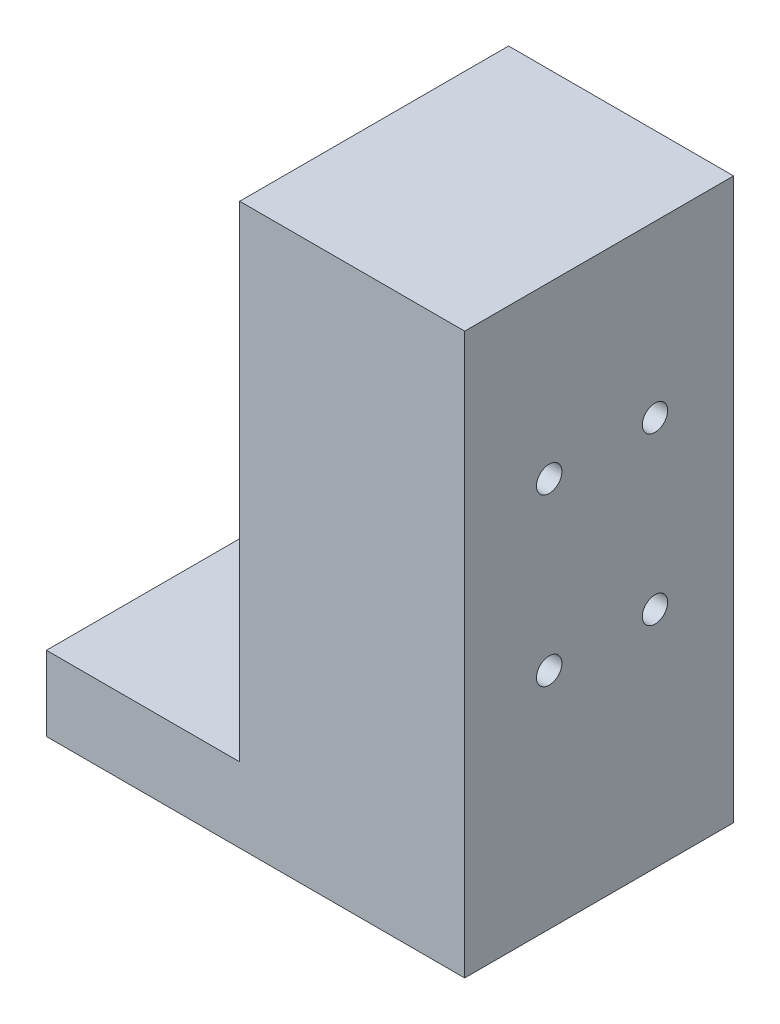
ISO-10303-21;
HEADER;
FILE_DESCRIPTION(('STEP AP214'),'2;1');
FILE_NAME('part.step','',(''),(''),'','','');
FILE_SCHEMA(('AUTOMOTIVE_DESIGN { 1 0 10303 214 1 1 1 1 }'));
ENDSEC;
DATA;
#1=APPLICATION_CONTEXT('core data for automotive mechanical design processes');
#2=APPLICATION_PROTOCOL_DEFINITION('international standard','automotive_design',2000,#1);
#3=PRODUCT_CONTEXT('',#1,'mechanical');
#4=PRODUCT('Part','Part','',(#3));
#5=PRODUCT_RELATED_PRODUCT_CATEGORY('part','',(#4));
#6=PRODUCT_DEFINITION_FORMATION('','',#4);
#7=PRODUCT_DEFINITION_CONTEXT('part definition',#1,'design');
#8=PRODUCT_DEFINITION('design','',#6,#7);
#9=PRODUCT_DEFINITION_SHAPE('','',#8);
#10=(LENGTH_UNIT() NAMED_UNIT(*) SI_UNIT(.MILLI.,.METRE.));
#11=(NAMED_UNIT(*) PLANE_ANGLE_UNIT() SI_UNIT($,.RADIAN.));
#12=(NAMED_UNIT(*) SI_UNIT($,.STERADIAN.) SOLID_ANGLE_UNIT());
#13=UNCERTAINTY_MEASURE_WITH_UNIT(LENGTH_MEASURE(1.E-05),#10,'distance_accuracy_value','');
#14=(GEOMETRIC_REPRESENTATION_CONTEXT(3) GLOBAL_UNCERTAINTY_ASSIGNED_CONTEXT((#13)) GLOBAL_UNIT_ASSIGNED_CONTEXT((#10,
#11,#12)) REPRESENTATION_CONTEXT('',''));
#15=CARTESIAN_POINT('',(0.,0.,0.));
#16=DIRECTION('',(0.,0.,1.));
#17=DIRECTION('',(1.,0.,0.));
#18=AXIS2_PLACEMENT_3D('',#15,#16,#17);
#19=CARTESIAN_POINT('',(13.3818394315692,-9.76666179693206,36.));
#20=DIRECTION('',(-1.,0.,0.));
#21=DIRECTION('',(0.,0.,1.));
#22=AXIS2_PLACEMENT_3D('',#19,#20,#21);
#23=PLANE('',#22);
#24=DIRECTION('',(0.,1.,0.));
#25=VECTOR('',#24,1.);
#26=CARTESIAN_POINT('',(13.3818394315692,-9.76666179693206,0.));
#27=LINE('',#26,#25);
#28=CARTESIAN_POINT('',(13.3818394315692,-9.76666179693206,0.));
#29=VERTEX_POINT('',#28);
#30=CARTESIAN_POINT('',(13.3818394315692,65.2333382030679,0.));
#31=VERTEX_POINT('',#30);
#32=EDGE_CURVE('E120',#29,#31,#27,.T.);
#33=ORIENTED_EDGE('',*,*,#32,.T.);
#34=DIRECTION('',(0.,0.,-1.));
#35=VECTOR('',#34,1.);
#36=CARTESIAN_POINT('',(13.3818394315692,65.2333382030679,36.));
#37=LINE('',#36,#35);
#38=CARTESIAN_POINT('',(13.3818394315692,65.2333382030679,36.));
#39=VERTEX_POINT('',#38);
#40=EDGE_CURVE('E113',#39,#31,#37,.T.);
#41=ORIENTED_EDGE('',*,*,#40,.F.);
#42=DIRECTION('',(0.,1.,0.));
#43=VECTOR('',#42,1.);
#44=CARTESIAN_POINT('',(13.3818394315692,-9.76666179693206,36.));
#45=LINE('',#44,#43);
#46=CARTESIAN_POINT('',(13.3818394315692,-9.76666179693206,36.));
#47=VERTEX_POINT('',#46);
#48=EDGE_CURVE('E102',#47,#39,#45,.T.);
#49=ORIENTED_EDGE('',*,*,#48,.F.);
#50=DIRECTION('',(0.,0.,-1.));
#51=VECTOR('',#50,1.);
#52=CARTESIAN_POINT('',(13.3818394315692,-9.76666179693206,36.));
#53=LINE('',#52,#51);
#54=EDGE_CURVE('E118',#47,#29,#53,.T.);
#55=ORIENTED_EDGE('',*,*,#54,.T.);
#56=EDGE_LOOP('',(#33,#41,#49,#55));
#57=FACE_BOUND('',#56,.T.);
#58=CARTESIAN_POINT('',(13.3818514315692,20.2333382030679,24.6876300052005));
#59=DIRECTION('',(1.,0.,0.));
#60=DIRECTION('',(0.,0.,-1.));
#61=AXIS2_PLACEMENT_3D('',#58,#59,#60);
#62=CIRCLE('',#61,1.7);
#63=CARTESIAN_POINT('',(13.3818514315692,20.2333382030679,22.9876300052005));
#64=VERTEX_POINT('',#63);
#65=EDGE_CURVE('E149',#64,#64,#62,.T.);
#66=ORIENTED_EDGE('',*,*,#65,.F.);
#67=EDGE_LOOP('',(#66));
#68=FACE_BOUND('',#67,.T.);
#69=CARTESIAN_POINT('',(13.3818514315692,42.4611100813664,10.5200880660826));
#70=DIRECTION('',(1.,0.,0.));
#71=DIRECTION('',(0.,0.,-1.));
#72=AXIS2_PLACEMENT_3D('',#69,#70,#71);
#73=CIRCLE('',#72,1.7);
#74=CARTESIAN_POINT('',(13.3818514315692,42.4611100813664,8.82008806608255));
#75=VERTEX_POINT('',#74);
#76=EDGE_CURVE('E210',#75,#75,#73,.T.);
#77=ORIENTED_EDGE('',*,*,#76,.F.);
#78=EDGE_LOOP('',(#77));
#79=FACE_BOUND('',#78,.T.);
#80=CARTESIAN_POINT('',(13.3818514315692,42.4611100813664,24.6876300052005));
#81=DIRECTION('',(1.,0.,0.));
#82=DIRECTION('',(0.,0.,-1.));
#83=AXIS2_PLACEMENT_3D('',#80,#81,#82);
#84=CIRCLE('',#83,1.7);
#85=CARTESIAN_POINT('',(13.3818514315692,42.4611100813664,22.9876300052005));
#86=VERTEX_POINT('',#85);
#87=EDGE_CURVE('E192',#86,#86,#84,.T.);
#88=ORIENTED_EDGE('',*,*,#87,.F.);
#89=EDGE_LOOP('',(#88));
#90=FACE_BOUND('',#89,.T.);
#91=CARTESIAN_POINT('',(13.3818514315692,20.2333382030679,10.5200880660826));
#92=DIRECTION('',(1.,0.,0.));
#93=DIRECTION('',(0.,0.,-1.));
#94=AXIS2_PLACEMENT_3D('',#91,#92,#93);
#95=CIRCLE('',#94,1.7);
#96=CARTESIAN_POINT('',(13.3818514315692,20.2333382030679,8.82008806608255));
#97=VERTEX_POINT('',#96);
#98=EDGE_CURVE('E204',#97,#97,#95,.T.);
#99=ORIENTED_EDGE('',*,*,#98,.F.);
#100=EDGE_LOOP('',(#99));
#101=FACE_BOUND('',#100,.T.);
#102=ADVANCED_FACE('F39',(#57,#68,#79,#90,#101),#23,.F.);
#103=CARTESIAN_POINT('',(-16.7428487947407,0.233338203067944,36.));
#104=DIRECTION('',(0.,-1.,0.));
#105=DIRECTION('',(0.,0.,-1.));
#106=AXIS2_PLACEMENT_3D('',#103,#104,#105);
#107=PLANE('',#106);
#108=CARTESIAN_POINT('',(-29.6805046815857,0.233338203067944,18.));
#109=DIRECTION('',(0.,1.,0.));
#110=DIRECTION('',(0.,0.,1.));
#111=AXIS2_PLACEMENT_3D('',#108,#109,#110);
#112=CIRCLE('',#111,2.625);
#113=CARTESIAN_POINT('',(-29.6805046815857,0.233338203067944,20.625));
#114=VERTEX_POINT('',#113);
#115=EDGE_CURVE('E158',#114,#114,#112,.T.);
#116=ORIENTED_EDGE('',*,*,#115,.F.);
#117=EDGE_LOOP('',(#116));
#118=FACE_BOUND('',#117,.T.);
#119=DIRECTION('',(-1.,0.,0.));
#120=VECTOR('',#119,1.);
#121=CARTESIAN_POINT('',(-16.7428487947407,0.233338203067944,0.));
#122=LINE('',#121,#120);
#123=CARTESIAN_POINT('',(-16.7428487947407,0.233338203067944,0.));
#124=VERTEX_POINT('',#123);
#125=CARTESIAN_POINT('',(-42.6181605684308,0.233338203067944,0.));
#126=VERTEX_POINT('',#125);
#127=EDGE_CURVE('E126',#124,#126,#122,.T.);
#128=ORIENTED_EDGE('',*,*,#127,.T.);
#129=DIRECTION('',(0.,0.,-1.));
#130=VECTOR('',#129,1.);
#131=CARTESIAN_POINT('',(-42.6181605684308,0.233338203067944,36.));
#132=LINE('',#131,#130);
#133=CARTESIAN_POINT('',(-42.6181605684308,0.233338203067944,36.));
#134=VERTEX_POINT('',#133);
#135=EDGE_CURVE('E11',#134,#126,#132,.T.);
#136=ORIENTED_EDGE('',*,*,#135,.F.);
#137=DIRECTION('',(-1.,0.,0.));
#138=VECTOR('',#137,1.);
#139=CARTESIAN_POINT('',(-16.7428487947407,0.233338203067944,36.));
#140=LINE('',#139,#138);
#141=CARTESIAN_POINT('',(-16.7428487947407,0.233338203067944,36.));
#142=VERTEX_POINT('',#141);
#143=EDGE_CURVE('E138',#142,#134,#140,.T.);
#144=ORIENTED_EDGE('',*,*,#143,.F.);
#145=DIRECTION('',(0.,0.,-1.));
#146=VECTOR('',#145,1.);
#147=CARTESIAN_POINT('',(-16.7428487947407,0.233338203067944,36.));
#148=LINE('',#147,#146);
#149=EDGE_CURVE('E123',#142,#124,#148,.T.);
#150=ORIENTED_EDGE('',*,*,#149,.T.);
#151=EDGE_LOOP('',(#128,#136,#144,#150));
#152=FACE_BOUND('',#151,.T.);
#153=ADVANCED_FACE('F41',(#118,#152),#107,.F.);
#154=CARTESIAN_POINT('',(-42.6181605684308,0.233338203067944,36.));
#155=DIRECTION('',(1.,0.,0.));
#156=DIRECTION('',(0.,1.,0.));
#157=AXIS2_PLACEMENT_3D('',#154,#155,#156);
#158=PLANE('',#157);
#159=DIRECTION('',(0.,-1.,0.));
#160=VECTOR('',#159,1.);
#161=CARTESIAN_POINT('',(-42.6181605684308,0.233338203067944,0.));
#162=LINE('',#161,#160);
#163=CARTESIAN_POINT('',(-42.6181605684308,-9.76666179693206,0.));
#164=VERTEX_POINT('',#163);
#165=EDGE_CURVE('E134',#126,#164,#162,.T.);
#166=ORIENTED_EDGE('',*,*,#165,.T.);
#167=DIRECTION('',(0.,0.,-1.));
#168=VECTOR('',#167,1.);
#169=CARTESIAN_POINT('',(-42.6181605684308,-9.76666179693206,36.));
#170=LINE('',#169,#168);
#171=CARTESIAN_POINT('',(-42.6181605684308,-9.76666179693206,36.));
#172=VERTEX_POINT('',#171);
#173=EDGE_CURVE('E51',#172,#164,#170,.T.);
#174=ORIENTED_EDGE('',*,*,#173,.F.);
#175=DIRECTION('',(0.,-1.,0.));
#176=VECTOR('',#175,1.);
#177=CARTESIAN_POINT('',(-42.6181605684308,0.233338203067944,36.));
#178=LINE('',#177,#176);
#179=EDGE_CURVE('E100',#134,#172,#178,.T.);
#180=ORIENTED_EDGE('',*,*,#179,.F.);
#181=ORIENTED_EDGE('',*,*,#135,.T.);
#182=EDGE_LOOP('',(#166,#174,#180,#181));
#183=FACE_BOUND('',#182,.T.);
#184=ADVANCED_FACE('F271',(#183),#158,.F.);
#185=CARTESIAN_POINT('',(-42.6181605684308,-9.76666179693206,36.));
#186=DIRECTION('',(0.,1.,0.));
#187=DIRECTION('',(0.,0.,1.));
#188=AXIS2_PLACEMENT_3D('',#185,#186,#187);
#189=PLANE('',#188);
#190=CARTESIAN_POINT('',(-29.6805046815857,-9.76666179693206,18.));
#191=DIRECTION('',(0.,1.,0.));
#192=DIRECTION('',(0.,0.,1.));
#193=AXIS2_PLACEMENT_3D('',#190,#191,#192);
#194=CIRCLE('',#193,2.625);
#195=CARTESIAN_POINT('',(-29.6805046815857,-9.76666179693206,20.625));
#196=VERTEX_POINT('',#195);
#197=EDGE_CURVE('E131',#196,#196,#194,.T.);
#198=ORIENTED_EDGE('',*,*,#197,.T.);
#199=EDGE_LOOP('',(#198));
#200=FACE_BOUND('',#199,.T.);
#201=DIRECTION('',(1.,0.,0.));
#202=VECTOR('',#201,1.);
#203=CARTESIAN_POINT('',(-42.6181605684308,-9.76666179693206,0.));
#204=LINE('',#203,#202);
#205=EDGE_CURVE('E133',#164,#29,#204,.T.);
#206=ORIENTED_EDGE('',*,*,#205,.T.);
#207=ORIENTED_EDGE('',*,*,#54,.F.);
#208=DIRECTION('',(1.,0.,0.));
#209=VECTOR('',#208,1.);
#210=CARTESIAN_POINT('',(-42.6181605684308,-9.76666179693206,36.));
#211=LINE('',#210,#209);
#212=EDGE_CURVE('E109',#172,#47,#211,.T.);
#213=ORIENTED_EDGE('',*,*,#212,.F.);
#214=ORIENTED_EDGE('',*,*,#173,.T.);
#215=EDGE_LOOP('',(#206,#207,#213,#214));
#216=FACE_BOUND('',#215,.T.);
#217=ADVANCED_FACE('F180',(#200,#216),#189,.F.);
#218=CARTESIAN_POINT('',(13.3818394315692,65.2333382030679,36.));
#219=DIRECTION('',(0.,-1.,0.));
#220=DIRECTION('',(0.,0.,-1.));
#221=AXIS2_PLACEMENT_3D('',#218,#219,#220);
#222=PLANE('',#221);
#223=DIRECTION('',(-1.,0.,0.));
#224=VECTOR('',#223,1.);
#225=CARTESIAN_POINT('',(13.3818394315692,65.2333382030679,0.));
#226=LINE('',#225,#224);
#227=CARTESIAN_POINT('',(-16.7428487947407,65.2333382030679,0.));
#228=VERTEX_POINT('',#227);
#229=EDGE_CURVE('E82',#31,#228,#226,.T.);
#230=ORIENTED_EDGE('',*,*,#229,.T.);
#231=DIRECTION('',(0.,0.,-1.));
#232=VECTOR('',#231,1.);
#233=CARTESIAN_POINT('',(-16.7428487947407,65.2333382030679,36.));
#234=LINE('',#233,#232);
#235=CARTESIAN_POINT('',(-16.7428487947407,65.2333382030679,36.));
#236=VERTEX_POINT('',#235);
#237=EDGE_CURVE('E117',#236,#228,#234,.T.);
#238=ORIENTED_EDGE('',*,*,#237,.F.);
#239=DIRECTION('',(-1.,0.,0.));
#240=VECTOR('',#239,1.);
#241=CARTESIAN_POINT('',(13.3818394315692,65.2333382030679,36.));
#242=LINE('',#241,#240);
#243=EDGE_CURVE('E107',#39,#236,#242,.T.);
#244=ORIENTED_EDGE('',*,*,#243,.F.);
#245=ORIENTED_EDGE('',*,*,#40,.T.);
#246=EDGE_LOOP('',(#230,#238,#244,#245));
#247=FACE_BOUND('',#246,.T.);
#248=ADVANCED_FACE('F125',(#247),#222,.F.);
#249=CARTESIAN_POINT('',(-16.7428487947407,65.2333382030679,36.));
#250=DIRECTION('',(1.,0.,0.));
#251=DIRECTION('',(0.,1.,0.));
#252=AXIS2_PLACEMENT_3D('',#249,#250,#251);
#253=PLANE('',#252);
#254=CARTESIAN_POINT('',(-16.7428487947407,20.2333382030679,10.5200880660826));
#255=DIRECTION('',(1.,0.,0.));
#256=DIRECTION('',(0.,1.,0.));
#257=AXIS2_PLACEMENT_3D('',#254,#255,#256);
#258=CIRCLE('',#257,1.7);
#259=CARTESIAN_POINT('',(-16.7428487947407,21.9333382030679,10.5200880660826));
#260=VERTEX_POINT('',#259);
#261=EDGE_CURVE('E154',#260,#260,#258,.T.);
#262=ORIENTED_EDGE('',*,*,#261,.T.);
#263=EDGE_LOOP('',(#262));
#264=FACE_BOUND('',#263,.T.);
#265=CARTESIAN_POINT('',(-16.7428487947407,42.4611100813664,24.6876300052005));
#266=DIRECTION('',(1.,0.,0.));
#267=DIRECTION('',(0.,1.,0.));
#268=AXIS2_PLACEMENT_3D('',#265,#266,#267);
#269=CIRCLE('',#268,1.7);
#270=CARTESIAN_POINT('',(-16.7428487947407,44.1611100813664,24.6876300052005));
#271=VERTEX_POINT('',#270);
#272=EDGE_CURVE('E155',#271,#271,#269,.T.);
#273=ORIENTED_EDGE('',*,*,#272,.T.);
#274=EDGE_LOOP('',(#273));
#275=FACE_BOUND('',#274,.T.);
#276=CARTESIAN_POINT('',(-16.7428487947407,42.4611100813664,10.5200880660826));
#277=DIRECTION('',(1.,0.,0.));
#278=DIRECTION('',(0.,1.,0.));
#279=AXIS2_PLACEMENT_3D('',#276,#277,#278);
#280=CIRCLE('',#279,1.7);
#281=CARTESIAN_POINT('',(-16.7428487947407,44.1611100813664,10.5200880660826));
#282=VERTEX_POINT('',#281);
#283=EDGE_CURVE('E146',#282,#282,#280,.T.);
#284=ORIENTED_EDGE('',*,*,#283,.T.);
#285=EDGE_LOOP('',(#284));
#286=FACE_BOUND('',#285,.T.);
#287=CARTESIAN_POINT('',(-16.7428487947407,20.2333382030679,24.6876300052005));
#288=DIRECTION('',(1.,0.,0.));
#289=DIRECTION('',(0.,1.,0.));
#290=AXIS2_PLACEMENT_3D('',#287,#288,#289);
#291=CIRCLE('',#290,1.7);
#292=CARTESIAN_POINT('',(-16.7428487947407,21.9333382030679,24.6876300052005));
#293=VERTEX_POINT('',#292);
#294=EDGE_CURVE('E144',#293,#293,#291,.T.);
#295=ORIENTED_EDGE('',*,*,#294,.T.);
#296=EDGE_LOOP('',(#295));
#297=FACE_BOUND('',#296,.T.);
#298=DIRECTION('',(0.,-1.,0.));
#299=VECTOR('',#298,1.);
#300=CARTESIAN_POINT('',(-16.7428487947407,65.2333382030679,0.));
#301=LINE('',#300,#299);
#302=EDGE_CURVE('E90',#228,#124,#301,.T.);
#303=ORIENTED_EDGE('',*,*,#302,.T.);
#304=ORIENTED_EDGE('',*,*,#149,.F.);
#305=DIRECTION('',(0.,-1.,0.));
#306=VECTOR('',#305,1.);
#307=CARTESIAN_POINT('',(-16.7428487947407,65.2333382030679,36.));
#308=LINE('',#307,#306);
#309=EDGE_CURVE('E58',#236,#142,#308,.T.);
#310=ORIENTED_EDGE('',*,*,#309,.F.);
#311=ORIENTED_EDGE('',*,*,#237,.T.);
#312=EDGE_LOOP('',(#303,#304,#310,#311));
#313=FACE_BOUND('',#312,.T.);
#314=ADVANCED_FACE('F279',(#264,#275,#286,#297,#313),#253,.F.);
#315=CARTESIAN_POINT('',(0.,0.,36.));
#316=DIRECTION('',(0.,0.,1.));
#317=DIRECTION('',(1.,0.,0.));
#318=AXIS2_PLACEMENT_3D('',#315,#316,#317);
#319=PLANE('',#318);
#320=ORIENTED_EDGE('',*,*,#143,.T.);
#321=ORIENTED_EDGE('',*,*,#179,.T.);
#322=ORIENTED_EDGE('',*,*,#212,.T.);
#323=ORIENTED_EDGE('',*,*,#48,.T.);
#324=ORIENTED_EDGE('',*,*,#243,.T.);
#325=ORIENTED_EDGE('',*,*,#309,.T.);
#326=EDGE_LOOP('',(#320,#321,#322,#323,#324,#325));
#327=FACE_BOUND('',#326,.T.);
#328=ADVANCED_FACE('F106',(#327),#319,.T.);
#329=CARTESIAN_POINT('',(0.,0.,0.));
#330=DIRECTION('',(0.,0.,1.));
#331=DIRECTION('',(1.,0.,0.));
#332=AXIS2_PLACEMENT_3D('',#329,#330,#331);
#333=PLANE('',#332);
#334=ORIENTED_EDGE('',*,*,#127,.F.);
#335=ORIENTED_EDGE('',*,*,#302,.F.);
#336=ORIENTED_EDGE('',*,*,#229,.F.);
#337=ORIENTED_EDGE('',*,*,#32,.F.);
#338=ORIENTED_EDGE('',*,*,#205,.F.);
#339=ORIENTED_EDGE('',*,*,#165,.F.);
#340=EDGE_LOOP('',(#334,#335,#336,#337,#338,#339));
#341=FACE_BOUND('',#340,.T.);
#342=ADVANCED_FACE('F277',(#341),#333,.F.);
#343=CARTESIAN_POINT('',(-29.6805046815857,-9.76666179693206,18.));
#344=DIRECTION('',(0.,1.,0.));
#345=DIRECTION('',(0.,0.,1.));
#346=AXIS2_PLACEMENT_3D('',#343,#344,#345);
#347=CYLINDRICAL_SURFACE('',#346,2.625);
#348=ORIENTED_EDGE('',*,*,#197,.F.);
#349=EDGE_LOOP('',(#348));
#350=FACE_BOUND('',#349,.T.);
#351=ORIENTED_EDGE('',*,*,#115,.T.);
#352=EDGE_LOOP('',(#351));
#353=FACE_BOUND('',#352,.T.);
#354=ADVANCED_FACE('F251',(#350,#353),#347,.F.);
#355=CARTESIAN_POINT('',(-42.6181605684308,20.2333382030679,24.6876300052005));
#356=DIRECTION('',(1.,0.,0.));
#357=DIRECTION('',(0.,0.,-1.));
#358=AXIS2_PLACEMENT_3D('',#355,#356,#357);
#359=CYLINDRICAL_SURFACE('',#358,1.7);
#360=ORIENTED_EDGE('',*,*,#65,.T.);
#361=EDGE_LOOP('',(#360));
#362=FACE_BOUND('',#361,.T.);
#363=ORIENTED_EDGE('',*,*,#294,.F.);
#364=EDGE_LOOP('',(#363));
#365=FACE_BOUND('',#364,.T.);
#366=ADVANCED_FACE('F234',(#362,#365),#359,.F.);
#367=CARTESIAN_POINT('',(-42.6181605684308,42.4611100813664,10.5200880660826));
#368=DIRECTION('',(1.,0.,0.));
#369=DIRECTION('',(0.,0.,-1.));
#370=AXIS2_PLACEMENT_3D('',#367,#368,#369);
#371=CYLINDRICAL_SURFACE('',#370,1.7);
#372=ORIENTED_EDGE('',*,*,#76,.T.);
#373=EDGE_LOOP('',(#372));
#374=FACE_BOUND('',#373,.T.);
#375=ORIENTED_EDGE('',*,*,#283,.F.);
#376=EDGE_LOOP('',(#375));
#377=FACE_BOUND('',#376,.T.);
#378=ADVANCED_FACE('F213',(#374,#377),#371,.F.);
#379=CARTESIAN_POINT('',(-42.6181605684308,42.4611100813664,24.6876300052005));
#380=DIRECTION('',(1.,0.,0.));
#381=DIRECTION('',(0.,0.,-1.));
#382=AXIS2_PLACEMENT_3D('',#379,#380,#381);
#383=CYLINDRICAL_SURFACE('',#382,1.7);
#384=ORIENTED_EDGE('',*,*,#87,.T.);
#385=EDGE_LOOP('',(#384));
#386=FACE_BOUND('',#385,.T.);
#387=ORIENTED_EDGE('',*,*,#272,.F.);
#388=EDGE_LOOP('',(#387));
#389=FACE_BOUND('',#388,.T.);
#390=ADVANCED_FACE('F233',(#386,#389),#383,.F.);
#391=CARTESIAN_POINT('',(-42.6181605684308,20.2333382030679,10.5200880660826));
#392=DIRECTION('',(1.,0.,0.));
#393=DIRECTION('',(0.,0.,-1.));
#394=AXIS2_PLACEMENT_3D('',#391,#392,#393);
#395=CYLINDRICAL_SURFACE('',#394,1.7);
#396=ORIENTED_EDGE('',*,*,#98,.T.);
#397=EDGE_LOOP('',(#396));
#398=FACE_BOUND('',#397,.T.);
#399=ORIENTED_EDGE('',*,*,#261,.F.);
#400=EDGE_LOOP('',(#399));
#401=FACE_BOUND('',#400,.T.);
#402=ADVANCED_FACE('F237',(#398,#401),#395,.F.);
#403=CLOSED_SHELL('',(#102,#153,#184,#217,#248,#314,#328,#342,#354,#366,#378,#390,#402));
#404=MANIFOLD_SOLID_BREP('B2',#403);
#405=ADVANCED_BREP_SHAPE_REPRESENTATION('',(#18,#404),#14);
#406=SHAPE_DEFINITION_REPRESENTATION(#9,#405);
ENDSEC;
END-ISO-10303-21;
